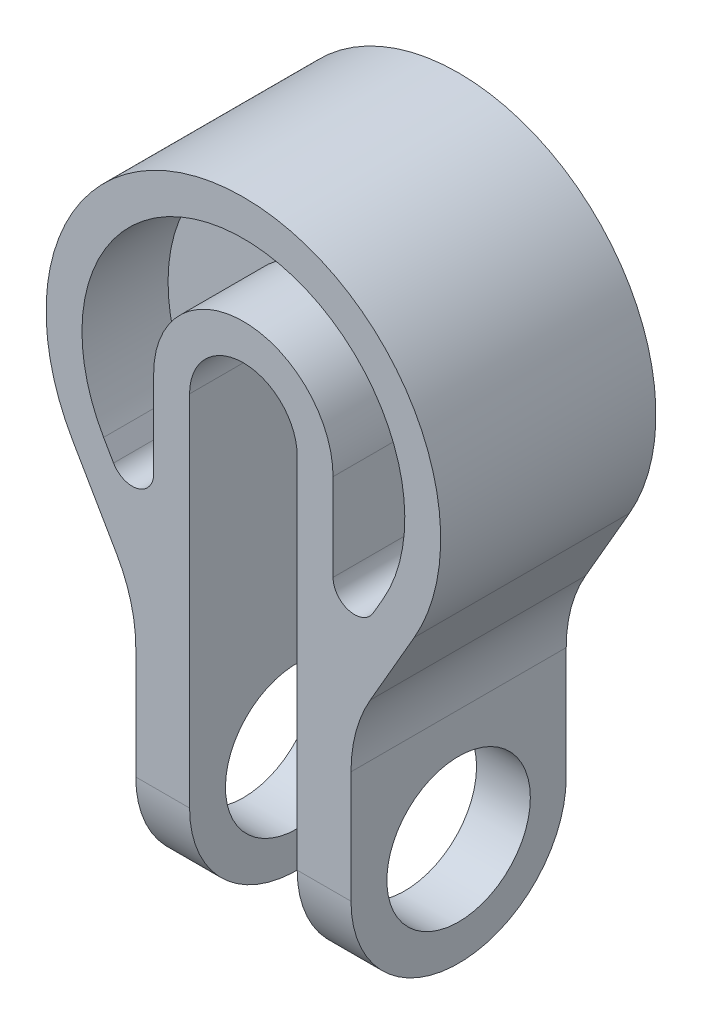
ISO-10303-21;
HEADER;
FILE_DESCRIPTION(('STEP AP214'),'2;1');
FILE_NAME('part.step','',(''),(''),'','','');
FILE_SCHEMA(('AUTOMOTIVE_DESIGN { 1 0 10303 214 1 1 1 1 }'));
ENDSEC;
DATA;
#1=APPLICATION_CONTEXT('core data for automotive mechanical design processes');
#2=APPLICATION_PROTOCOL_DEFINITION('international standard','automotive_design',2000,#1);
#3=PRODUCT_CONTEXT('',#1,'mechanical');
#4=PRODUCT('Part','Part','',(#3));
#5=PRODUCT_RELATED_PRODUCT_CATEGORY('part','',(#4));
#6=PRODUCT_DEFINITION_FORMATION('','',#4);
#7=PRODUCT_DEFINITION_CONTEXT('part definition',#1,'design');
#8=PRODUCT_DEFINITION('design','',#6,#7);
#9=PRODUCT_DEFINITION_SHAPE('','',#8);
#10=(LENGTH_UNIT() NAMED_UNIT(*) SI_UNIT(.MILLI.,.METRE.));
#11=(NAMED_UNIT(*) PLANE_ANGLE_UNIT() SI_UNIT($,.RADIAN.));
#12=(NAMED_UNIT(*) SI_UNIT($,.STERADIAN.) SOLID_ANGLE_UNIT());
#13=UNCERTAINTY_MEASURE_WITH_UNIT(LENGTH_MEASURE(1.E-05),#10,'distance_accuracy_value','');
#14=(GEOMETRIC_REPRESENTATION_CONTEXT(3) GLOBAL_UNCERTAINTY_ASSIGNED_CONTEXT((#13)) GLOBAL_UNIT_ASSIGNED_CONTEXT((#10,
#11,#12)) REPRESENTATION_CONTEXT('',''));
#15=CARTESIAN_POINT('',(0.,0.,0.));
#16=DIRECTION('',(0.,0.,1.));
#17=DIRECTION('',(1.,0.,0.));
#18=AXIS2_PLACEMENT_3D('',#15,#16,#17);
#19=CARTESIAN_POINT('',(0.,0.,-15.));
#20=DIRECTION('',(0.,0.,-1.));
#21=DIRECTION('',(1.,0.,0.));
#22=AXIS2_PLACEMENT_3D('',#19,#20,#21);
#23=PLANE('',#22);
#24=CARTESIAN_POINT('',(0.,0.,-15.));
#25=DIRECTION('',(0.,0.,1.));
#26=DIRECTION('',(1.,0.,0.));
#27=AXIS2_PLACEMENT_3D('',#24,#25,#26);
#28=CIRCLE('',#27,22.5);
#29=CARTESIAN_POINT('',(19.4855715851499,-11.2499999999999,-15.));
#30=VERTEX_POINT('',#29);
#31=CARTESIAN_POINT('',(-19.4855715851499,-11.2499999999999,-15.));
#32=VERTEX_POINT('',#31);
#33=EDGE_CURVE('E545',#30,#32,#28,.T.);
#34=ORIENTED_EDGE('',*,*,#33,.T.);
#35=DIRECTION('',(0.499999999999995,-0.866025403784441,0.));
#36=VECTOR('',#35,1.);
#37=CARTESIAN_POINT('',(-19.4855715851499,-11.2499999999999,-15.));
#38=LINE('',#37,#36);
#39=CARTESIAN_POINT('',(-18.0980762113533,-13.6532124826824,-15.));
#40=VERTEX_POINT('',#39);
#41=EDGE_CURVE('E538',#32,#40,#38,.T.);
#42=ORIENTED_EDGE('',*,*,#41,.T.);
#43=CARTESIAN_POINT('',(-15.5,-12.1532124826824,-15.));
#44=DIRECTION('',(0.,0.,1.));
#45=DIRECTION('',(-1.,0.,0.));
#46=AXIS2_PLACEMENT_3D('',#43,#44,#45);
#47=CIRCLE('',#46,3.);
#48=CARTESIAN_POINT('',(-12.5,-12.1532124826824,-15.));
#49=VERTEX_POINT('',#48);
#50=EDGE_CURVE('E534',#40,#49,#47,.T.);
#51=ORIENTED_EDGE('',*,*,#50,.T.);
#52=DIRECTION('',(0.,1.,0.));
#53=VECTOR('',#52,1.);
#54=CARTESIAN_POINT('',(-12.5,0.,-15.));
#55=LINE('',#54,#53);
#56=CARTESIAN_POINT('',(-12.5,0.,-15.));
#57=VERTEX_POINT('',#56);
#58=EDGE_CURVE('E529',#49,#57,#55,.T.);
#59=ORIENTED_EDGE('',*,*,#58,.T.);
#60=CARTESIAN_POINT('',(0.,0.,-15.));
#61=DIRECTION('',(0.,0.,-1.));
#62=DIRECTION('',(1.,0.,0.));
#63=AXIS2_PLACEMENT_3D('',#60,#61,#62);
#64=CIRCLE('',#63,12.5);
#65=CARTESIAN_POINT('',(12.5,0.,-15.));
#66=VERTEX_POINT('',#65);
#67=EDGE_CURVE('E528',#57,#66,#64,.T.);
#68=ORIENTED_EDGE('',*,*,#67,.T.);
#69=DIRECTION('',(0.,-1.,0.));
#70=VECTOR('',#69,1.);
#71=CARTESIAN_POINT('',(12.5,0.,-15.));
#72=LINE('',#71,#70);
#73=CARTESIAN_POINT('',(12.5,-12.1532124826824,-15.));
#74=VERTEX_POINT('',#73);
#75=EDGE_CURVE('E525',#66,#74,#72,.T.);
#76=ORIENTED_EDGE('',*,*,#75,.T.);
#77=CARTESIAN_POINT('',(15.5,-12.1532124826824,-15.));
#78=DIRECTION('',(0.,0.,1.));
#79=DIRECTION('',(1.,0.,0.));
#80=AXIS2_PLACEMENT_3D('',#77,#78,#79);
#81=CIRCLE('',#80,3.);
#82=CARTESIAN_POINT('',(18.0980762113533,-13.6532124826824,-15.));
#83=VERTEX_POINT('',#82);
#84=EDGE_CURVE('E519',#74,#83,#81,.T.);
#85=ORIENTED_EDGE('',*,*,#84,.T.);
#86=DIRECTION('',(0.499999999999994,0.866025403784442,0.));
#87=VECTOR('',#86,1.);
#88=CARTESIAN_POINT('',(19.4855715851499,-11.2499999999999,-15.));
#89=LINE('',#88,#87);
#90=EDGE_CURVE('E511',#83,#30,#89,.T.);
#91=ORIENTED_EDGE('',*,*,#90,.T.);
#92=EDGE_LOOP('',(#34,#42,#51,#59,#68,#76,#85,#91));
#93=FACE_BOUND('',#92,.T.);
#94=DIRECTION('',(0.,1.,0.));
#95=VECTOR('',#94,1.);
#96=CARTESIAN_POINT('',(-7.5,0.,-15.));
#97=LINE('',#96,#95);
#98=CARTESIAN_POINT('',(-7.49999999999999,-50.,-15.));
#99=VERTEX_POINT('',#98);
#100=CARTESIAN_POINT('',(-7.5,0.,-15.));
#101=VERTEX_POINT('',#100);
#102=EDGE_CURVE('E281',#99,#101,#97,.T.);
#103=ORIENTED_EDGE('',*,*,#102,.F.);
#104=DIRECTION('',(-1.,0.,0.));
#105=VECTOR('',#104,1.);
#106=CARTESIAN_POINT('',(27.501,-50.,-15.));
#107=LINE('',#106,#105);
#108=CARTESIAN_POINT('',(-15.,-50.,-15.));
#109=VERTEX_POINT('',#108);
#110=EDGE_CURVE('E287',#99,#109,#107,.T.);
#111=ORIENTED_EDGE('',*,*,#110,.T.);
#112=DIRECTION('',(0.,-1.,0.));
#113=VECTOR('',#112,1.);
#114=CARTESIAN_POINT('',(-15.,-42.2959682021173,-15.));
#115=LINE('',#114,#113);
#116=CARTESIAN_POINT('',(-15.,-34.3782217350893,-15.));
#117=VERTEX_POINT('',#116);
#118=EDGE_CURVE('E301',#117,#109,#115,.T.);
#119=ORIENTED_EDGE('',*,*,#118,.F.);
#120=CARTESIAN_POINT('',(-35.,-34.3782217350893,-15.));
#121=DIRECTION('',(0.,0.,-1.));
#122=DIRECTION('',(1.,0.,0.));
#123=AXIS2_PLACEMENT_3D('',#120,#121,#122);
#124=CIRCLE('',#123,20.);
#125=CARTESIAN_POINT('',(-17.6794919243112,-24.3782217350893,-15.));
#126=VERTEX_POINT('',#125);
#127=EDGE_CURVE('E310',#126,#117,#124,.T.);
#128=ORIENTED_EDGE('',*,*,#127,.F.);
#129=DIRECTION('',(0.500000000000001,-0.866025403784438,0.));
#130=VECTOR('',#129,1.);
#131=CARTESIAN_POINT('',(-23.8156986040721,-13.75,-15.));
#132=LINE('',#131,#130);
#133=CARTESIAN_POINT('',(-23.8156986040721,-13.75,-15.));
#134=VERTEX_POINT('',#133);
#135=EDGE_CURVE('E480',#134,#126,#132,.T.);
#136=ORIENTED_EDGE('',*,*,#135,.F.);
#137=CARTESIAN_POINT('',(0.,0.,-15.));
#138=DIRECTION('',(0.,0.,1.));
#139=DIRECTION('',(1.,0.,0.));
#140=AXIS2_PLACEMENT_3D('',#137,#138,#139);
#141=CIRCLE('',#140,27.5);
#142=CARTESIAN_POINT('',(23.8156986040721,-13.75,-15.));
#143=VERTEX_POINT('',#142);
#144=EDGE_CURVE('E483',#143,#134,#141,.T.);
#145=ORIENTED_EDGE('',*,*,#144,.F.);
#146=DIRECTION('',(0.5,0.866025403784439,0.));
#147=VECTOR('',#146,1.);
#148=CARTESIAN_POINT('',(23.8156986040721,-13.75,-15.));
#149=LINE('',#148,#147);
#150=CARTESIAN_POINT('',(17.6794919243112,-24.3782217350893,-15.));
#151=VERTEX_POINT('',#150);
#152=EDGE_CURVE('E323',#151,#143,#149,.T.);
#153=ORIENTED_EDGE('',*,*,#152,.F.);
#154=CARTESIAN_POINT('',(35.,-34.3782217350893,-15.));
#155=DIRECTION('',(0.,0.,-1.));
#156=DIRECTION('',(-1.,0.,0.));
#157=AXIS2_PLACEMENT_3D('',#154,#155,#156);
#158=CIRCLE('',#157,20.);
#159=CARTESIAN_POINT('',(15.,-34.3782217350893,-15.));
#160=VERTEX_POINT('',#159);
#161=EDGE_CURVE('E317',#160,#151,#158,.T.);
#162=ORIENTED_EDGE('',*,*,#161,.F.);
#163=DIRECTION('',(0.,1.,0.));
#164=VECTOR('',#163,1.);
#165=CARTESIAN_POINT('',(15.,-65.,-15.));
#166=LINE('',#165,#164);
#167=CARTESIAN_POINT('',(15.,-50.,-15.));
#168=VERTEX_POINT('',#167);
#169=EDGE_CURVE('E316',#168,#160,#166,.T.);
#170=ORIENTED_EDGE('',*,*,#169,.F.);
#171=DIRECTION('',(1.,0.,0.));
#172=VECTOR('',#171,1.);
#173=CARTESIAN_POINT('',(-27.501,-50.,-15.));
#174=LINE('',#173,#172);
#175=CARTESIAN_POINT('',(7.50000000000001,-50.,-15.));
#176=VERTEX_POINT('',#175);
#177=EDGE_CURVE('E578',#176,#168,#174,.T.);
#178=ORIENTED_EDGE('',*,*,#177,.F.);
#179=DIRECTION('',(0.,-1.,0.));
#180=VECTOR('',#179,1.);
#181=CARTESIAN_POINT('',(7.5,0.,-15.));
#182=LINE('',#181,#180);
#183=CARTESIAN_POINT('',(7.5,0.,-15.));
#184=VERTEX_POINT('',#183);
#185=EDGE_CURVE('E307',#184,#176,#182,.T.);
#186=ORIENTED_EDGE('',*,*,#185,.F.);
#187=CARTESIAN_POINT('',(0.,0.,-15.));
#188=DIRECTION('',(0.,0.,-1.));
#189=DIRECTION('',(1.,0.,0.));
#190=AXIS2_PLACEMENT_3D('',#187,#188,#189);
#191=CIRCLE('',#190,7.5);
#192=EDGE_CURVE('E303',#101,#184,#191,.T.);
#193=ORIENTED_EDGE('',*,*,#192,.F.);
#194=EDGE_LOOP('',(#103,#111,#119,#128,#136,#145,#153,#162,#170,#178,#186,#193));
#195=FACE_BOUND('',#194,.T.);
#196=ADVANCED_FACE('F91',(#93,#195),#23,.T.);
#197=CARTESIAN_POINT('',(0.,0.,15.));
#198=DIRECTION('',(0.,0.,1.));
#199=DIRECTION('',(1.,0.,0.));
#200=AXIS2_PLACEMENT_3D('',#197,#198,#199);
#201=PLANE('',#200);
#202=DIRECTION('',(-1.,0.,0.));
#203=VECTOR('',#202,1.);
#204=CARTESIAN_POINT('',(27.501,-50.,15.));
#205=LINE('',#204,#203);
#206=CARTESIAN_POINT('',(-7.49999999999999,-50.,15.));
#207=VERTEX_POINT('',#206);
#208=CARTESIAN_POINT('',(-15.,-50.,15.));
#209=VERTEX_POINT('',#208);
#210=EDGE_CURVE('E589',#207,#209,#205,.T.);
#211=ORIENTED_EDGE('',*,*,#210,.F.);
#212=DIRECTION('',(0.,1.,0.));
#213=VECTOR('',#212,1.);
#214=CARTESIAN_POINT('',(-7.5,0.,15.));
#215=LINE('',#214,#213);
#216=CARTESIAN_POINT('',(-7.5,0.,15.));
#217=VERTEX_POINT('',#216);
#218=EDGE_CURVE('E288',#207,#217,#215,.T.);
#219=ORIENTED_EDGE('',*,*,#218,.T.);
#220=CARTESIAN_POINT('',(0.,0.,15.));
#221=DIRECTION('',(0.,0.,-1.));
#222=DIRECTION('',(1.,0.,0.));
#223=AXIS2_PLACEMENT_3D('',#220,#221,#222);
#224=CIRCLE('',#223,7.5);
#225=CARTESIAN_POINT('',(7.5,0.,15.));
#226=VERTEX_POINT('',#225);
#227=EDGE_CURVE('E431',#217,#226,#224,.T.);
#228=ORIENTED_EDGE('',*,*,#227,.T.);
#229=DIRECTION('',(0.,-1.,0.));
#230=VECTOR('',#229,1.);
#231=CARTESIAN_POINT('',(7.5,0.,15.));
#232=LINE('',#231,#230);
#233=CARTESIAN_POINT('',(7.50000000000001,-50.,15.));
#234=VERTEX_POINT('',#233);
#235=EDGE_CURVE('E432',#226,#234,#232,.T.);
#236=ORIENTED_EDGE('',*,*,#235,.T.);
#237=DIRECTION('',(1.,0.,0.));
#238=VECTOR('',#237,1.);
#239=CARTESIAN_POINT('',(-27.501,-50.,15.));
#240=LINE('',#239,#238);
#241=CARTESIAN_POINT('',(15.,-50.,15.));
#242=VERTEX_POINT('',#241);
#243=EDGE_CURVE('E568',#234,#242,#240,.T.);
#244=ORIENTED_EDGE('',*,*,#243,.T.);
#245=DIRECTION('',(0.,1.,0.));
#246=VECTOR('',#245,1.);
#247=CARTESIAN_POINT('',(15.,-65.,15.));
#248=LINE('',#247,#246);
#249=CARTESIAN_POINT('',(15.,-34.3782217350893,15.));
#250=VERTEX_POINT('',#249);
#251=EDGE_CURVE('E437',#242,#250,#248,.T.);
#252=ORIENTED_EDGE('',*,*,#251,.T.);
#253=CARTESIAN_POINT('',(35.,-34.3782217350893,15.));
#254=DIRECTION('',(0.,0.,-1.));
#255=DIRECTION('',(-1.,0.,0.));
#256=AXIS2_PLACEMENT_3D('',#253,#254,#255);
#257=CIRCLE('',#256,20.);
#258=CARTESIAN_POINT('',(17.6794919243112,-24.3782217350893,15.));
#259=VERTEX_POINT('',#258);
#260=EDGE_CURVE('E442',#250,#259,#257,.T.);
#261=ORIENTED_EDGE('',*,*,#260,.T.);
#262=DIRECTION('',(0.5,0.866025403784439,0.));
#263=VECTOR('',#262,1.);
#264=CARTESIAN_POINT('',(23.8156986040721,-13.75,15.));
#265=LINE('',#264,#263);
#266=CARTESIAN_POINT('',(23.8156986040721,-13.75,15.));
#267=VERTEX_POINT('',#266);
#268=EDGE_CURVE('E441',#259,#267,#265,.T.);
#269=ORIENTED_EDGE('',*,*,#268,.T.);
#270=CARTESIAN_POINT('',(0.,0.,15.));
#271=DIRECTION('',(0.,0.,1.));
#272=DIRECTION('',(1.,0.,0.));
#273=AXIS2_PLACEMENT_3D('',#270,#271,#272);
#274=CIRCLE('',#273,27.5);
#275=CARTESIAN_POINT('',(-23.8156986040721,-13.75,15.));
#276=VERTEX_POINT('',#275);
#277=EDGE_CURVE('E391',#267,#276,#274,.T.);
#278=ORIENTED_EDGE('',*,*,#277,.T.);
#279=DIRECTION('',(0.500000000000001,-0.866025403784438,0.));
#280=VECTOR('',#279,1.);
#281=CARTESIAN_POINT('',(-23.8156986040721,-13.75,15.));
#282=LINE('',#281,#280);
#283=CARTESIAN_POINT('',(-17.6794919243112,-24.3782217350893,15.));
#284=VERTEX_POINT('',#283);
#285=EDGE_CURVE('E420',#276,#284,#282,.T.);
#286=ORIENTED_EDGE('',*,*,#285,.T.);
#287=CARTESIAN_POINT('',(-35.,-34.3782217350893,15.));
#288=DIRECTION('',(0.,0.,-1.));
#289=DIRECTION('',(1.,0.,0.));
#290=AXIS2_PLACEMENT_3D('',#287,#288,#289);
#291=CIRCLE('',#290,20.);
#292=CARTESIAN_POINT('',(-15.,-34.3782217350893,15.));
#293=VERTEX_POINT('',#292);
#294=EDGE_CURVE('E425',#284,#293,#291,.T.);
#295=ORIENTED_EDGE('',*,*,#294,.T.);
#296=DIRECTION('',(0.,-1.,0.));
#297=VECTOR('',#296,1.);
#298=CARTESIAN_POINT('',(-15.,-42.2959682021173,15.));
#299=LINE('',#298,#297);
#300=EDGE_CURVE('E422',#293,#209,#299,.T.);
#301=ORIENTED_EDGE('',*,*,#300,.T.);
#302=EDGE_LOOP('',(#211,#219,#228,#236,#244,#252,#261,#269,#278,#286,#295,#301));
#303=FACE_BOUND('',#302,.T.);
#304=CARTESIAN_POINT('',(0.,0.,15.));
#305=DIRECTION('',(0.,0.,1.));
#306=DIRECTION('',(1.,0.,0.));
#307=AXIS2_PLACEMENT_3D('',#304,#305,#306);
#308=CIRCLE('',#307,22.5);
#309=CARTESIAN_POINT('',(19.4855715851499,-11.2499999999999,15.));
#310=VERTEX_POINT('',#309);
#311=CARTESIAN_POINT('',(-19.4855715851499,-11.2499999999999,15.));
#312=VERTEX_POINT('',#311);
#313=EDGE_CURVE('E330',#310,#312,#308,.T.);
#314=ORIENTED_EDGE('',*,*,#313,.F.);
#315=DIRECTION('',(0.499999999999994,0.866025403784442,0.));
#316=VECTOR('',#315,1.);
#317=CARTESIAN_POINT('',(19.4855715851499,-11.2499999999999,15.));
#318=LINE('',#317,#316);
#319=CARTESIAN_POINT('',(18.0980762113533,-13.6532124826824,15.));
#320=VERTEX_POINT('',#319);
#321=EDGE_CURVE('E334',#320,#310,#318,.T.);
#322=ORIENTED_EDGE('',*,*,#321,.F.);
#323=CARTESIAN_POINT('',(15.5,-12.1532124826824,15.));
#324=DIRECTION('',(0.,0.,1.));
#325=DIRECTION('',(1.,0.,0.));
#326=AXIS2_PLACEMENT_3D('',#323,#324,#325);
#327=CIRCLE('',#326,3.);
#328=CARTESIAN_POINT('',(12.5,-12.1532124826824,15.));
#329=VERTEX_POINT('',#328);
#330=EDGE_CURVE('E383',#329,#320,#327,.T.);
#331=ORIENTED_EDGE('',*,*,#330,.F.);
#332=DIRECTION('',(0.,-1.,0.));
#333=VECTOR('',#332,1.);
#334=CARTESIAN_POINT('',(12.5,0.,15.));
#335=LINE('',#334,#333);
#336=CARTESIAN_POINT('',(12.5,0.,15.));
#337=VERTEX_POINT('',#336);
#338=EDGE_CURVE('E379',#337,#329,#335,.T.);
#339=ORIENTED_EDGE('',*,*,#338,.F.);
#340=CARTESIAN_POINT('',(0.,0.,15.));
#341=DIRECTION('',(0.,0.,-1.));
#342=DIRECTION('',(1.,0.,0.));
#343=AXIS2_PLACEMENT_3D('',#340,#341,#342);
#344=CIRCLE('',#343,12.5);
#345=CARTESIAN_POINT('',(-12.5,0.,15.));
#346=VERTEX_POINT('',#345);
#347=EDGE_CURVE('E376',#346,#337,#344,.T.);
#348=ORIENTED_EDGE('',*,*,#347,.F.);
#349=DIRECTION('',(0.,1.,0.));
#350=VECTOR('',#349,1.);
#351=CARTESIAN_POINT('',(-12.5,0.,15.));
#352=LINE('',#351,#350);
#353=CARTESIAN_POINT('',(-12.5,-12.1532124826824,15.));
#354=VERTEX_POINT('',#353);
#355=EDGE_CURVE('E375',#354,#346,#352,.T.);
#356=ORIENTED_EDGE('',*,*,#355,.F.);
#357=CARTESIAN_POINT('',(-15.5,-12.1532124826824,15.));
#358=DIRECTION('',(0.,0.,1.));
#359=DIRECTION('',(-1.,0.,0.));
#360=AXIS2_PLACEMENT_3D('',#357,#358,#359);
#361=CIRCLE('',#360,3.);
#362=CARTESIAN_POINT('',(-18.0980762113533,-13.6532124826824,15.));
#363=VERTEX_POINT('',#362);
#364=EDGE_CURVE('E366',#363,#354,#361,.T.);
#365=ORIENTED_EDGE('',*,*,#364,.F.);
#366=DIRECTION('',(0.499999999999995,-0.866025403784441,0.));
#367=VECTOR('',#366,1.);
#368=CARTESIAN_POINT('',(-19.4855715851499,-11.2499999999999,15.));
#369=LINE('',#368,#367);
#370=EDGE_CURVE('E365',#312,#363,#369,.T.);
#371=ORIENTED_EDGE('',*,*,#370,.F.);
#372=EDGE_LOOP('',(#314,#322,#331,#339,#348,#356,#365,#371));
#373=FACE_BOUND('',#372,.T.);
#374=ADVANCED_FACE('F621',(#303,#373),#201,.T.);
#375=CARTESIAN_POINT('',(0.,0.,15.));
#376=DIRECTION('',(0.,0.,-1.));
#377=DIRECTION('',(-1.,0.,0.));
#378=AXIS2_PLACEMENT_3D('',#375,#376,#377);
#379=CYLINDRICAL_SURFACE('',#378,27.5);
#380=DIRECTION('',(0.,0.,-1.));
#381=VECTOR('',#380,1.);
#382=CARTESIAN_POINT('',(23.8156986040721,-13.75,15.));
#383=LINE('',#382,#381);
#384=EDGE_CURVE('E450',#267,#143,#383,.T.);
#385=ORIENTED_EDGE('',*,*,#384,.T.);
#386=ORIENTED_EDGE('',*,*,#144,.T.);
#387=DIRECTION('',(0.,0.,-1.));
#388=VECTOR('',#387,1.);
#389=CARTESIAN_POINT('',(-23.8156986040721,-13.75,15.));
#390=LINE('',#389,#388);
#391=EDGE_CURVE('E12',#276,#134,#390,.T.);
#392=ORIENTED_EDGE('',*,*,#391,.F.);
#393=ORIENTED_EDGE('',*,*,#277,.F.);
#394=EDGE_LOOP('',(#385,#386,#392,#393));
#395=FACE_BOUND('',#394,.T.);
#396=ADVANCED_FACE('F92',(#395),#379,.T.);
#397=CARTESIAN_POINT('',(-23.8156986040721,-13.75,15.));
#398=DIRECTION('',(0.866025403784438,0.500000000000001,0.));
#399=DIRECTION('',(-0.500000000000001,0.866025403784438,0.));
#400=AXIS2_PLACEMENT_3D('',#397,#398,#399);
#401=PLANE('',#400);
#402=ORIENTED_EDGE('',*,*,#391,.T.);
#403=ORIENTED_EDGE('',*,*,#135,.T.);
#404=DIRECTION('',(0.,0.,-1.));
#405=VECTOR('',#404,1.);
#406=CARTESIAN_POINT('',(-17.6794919243112,-24.3782217350893,15.));
#407=LINE('',#406,#405);
#408=EDGE_CURVE('E105',#284,#126,#407,.T.);
#409=ORIENTED_EDGE('',*,*,#408,.F.);
#410=ORIENTED_EDGE('',*,*,#285,.F.);
#411=EDGE_LOOP('',(#402,#403,#409,#410));
#412=FACE_BOUND('',#411,.T.);
#413=ADVANCED_FACE('F477',(#412),#401,.F.);
#414=CARTESIAN_POINT('',(-35.,-34.3782217350893,15.));
#415=DIRECTION('',(0.,0.,-1.));
#416=DIRECTION('',(-1.,0.,0.));
#417=AXIS2_PLACEMENT_3D('',#414,#415,#416);
#418=CYLINDRICAL_SURFACE('',#417,20.);
#419=ORIENTED_EDGE('',*,*,#408,.T.);
#420=ORIENTED_EDGE('',*,*,#127,.T.);
#421=DIRECTION('',(0.,0.,-1.));
#422=VECTOR('',#421,1.);
#423=CARTESIAN_POINT('',(-15.,-34.3782217350893,15.));
#424=LINE('',#423,#422);
#425=EDGE_CURVE('E464',#293,#117,#424,.T.);
#426=ORIENTED_EDGE('',*,*,#425,.F.);
#427=ORIENTED_EDGE('',*,*,#294,.F.);
#428=EDGE_LOOP('',(#419,#420,#426,#427));
#429=FACE_BOUND('',#428,.T.);
#430=ADVANCED_FACE('F473',(#429),#418,.F.);
#431=CARTESIAN_POINT('',(-15.,-65.,15.));
#432=DIRECTION('',(1.,0.,0.));
#433=DIRECTION('',(0.,0.,-1.));
#434=AXIS2_PLACEMENT_3D('',#431,#432,#433);
#435=PLANE('',#434);
#436=ORIENTED_EDGE('',*,*,#118,.T.);
#437=CARTESIAN_POINT('',(-15.,-50.,0.));
#438=DIRECTION('',(1.,0.,0.));
#439=DIRECTION('',(0.,0.,-1.));
#440=AXIS2_PLACEMENT_3D('',#437,#438,#439);
#441=CIRCLE('',#440,15.);
#442=EDGE_CURVE('E108',#209,#109,#441,.T.);
#443=ORIENTED_EDGE('',*,*,#442,.F.);
#444=ORIENTED_EDGE('',*,*,#300,.F.);
#445=ORIENTED_EDGE('',*,*,#425,.T.);
#446=EDGE_LOOP('',(#436,#443,#444,#445));
#447=FACE_BOUND('',#446,.T.);
#448=CARTESIAN_POINT('',(-15.,-50.,0.));
#449=DIRECTION('',(1.,0.,0.));
#450=DIRECTION('',(0.,0.,-1.));
#451=AXIS2_PLACEMENT_3D('',#448,#449,#450);
#452=CIRCLE('',#451,10.);
#453=CARTESIAN_POINT('',(-15.,-50.,-10.));
#454=VERTEX_POINT('',#453);
#455=EDGE_CURVE('E297',#454,#454,#452,.T.);
#456=ORIENTED_EDGE('',*,*,#455,.T.);
#457=EDGE_LOOP('',(#456));
#458=FACE_BOUND('',#457,.T.);
#459=ADVANCED_FACE('F605',(#447,#458),#435,.F.);
#460=CARTESIAN_POINT('',(-7.5,0.,15.));
#461=DIRECTION('',(-1.,0.,0.));
#462=DIRECTION('',(0.,-1.,0.));
#463=AXIS2_PLACEMENT_3D('',#460,#461,#462);
#464=PLANE('',#463);
#465=CARTESIAN_POINT('',(-7.49999999999999,-50.,0.));
#466=DIRECTION('',(-1.,0.,0.));
#467=DIRECTION('',(0.,-1.,0.));
#468=AXIS2_PLACEMENT_3D('',#465,#466,#467);
#469=CIRCLE('',#468,15.);
#470=EDGE_CURVE('E276',#99,#207,#469,.T.);
#471=ORIENTED_EDGE('',*,*,#470,.F.);
#472=ORIENTED_EDGE('',*,*,#102,.T.);
#473=DIRECTION('',(0.,0.,-1.));
#474=VECTOR('',#473,1.);
#475=CARTESIAN_POINT('',(-7.5,0.,15.));
#476=LINE('',#475,#474);
#477=EDGE_CURVE('E458',#217,#101,#476,.T.);
#478=ORIENTED_EDGE('',*,*,#477,.F.);
#479=ORIENTED_EDGE('',*,*,#218,.F.);
#480=EDGE_LOOP('',(#471,#472,#478,#479));
#481=FACE_BOUND('',#480,.T.);
#482=CARTESIAN_POINT('',(-7.49999999999999,-50.,0.));
#483=DIRECTION('',(-1.,0.,0.));
#484=DIRECTION('',(0.,-1.,0.));
#485=AXIS2_PLACEMENT_3D('',#482,#483,#484);
#486=CIRCLE('',#485,10.);
#487=CARTESIAN_POINT('',(-7.49999999999999,-60.,0.));
#488=VERTEX_POINT('',#487);
#489=EDGE_CURVE('E592',#488,#488,#486,.T.);
#490=ORIENTED_EDGE('',*,*,#489,.T.);
#491=EDGE_LOOP('',(#490));
#492=FACE_BOUND('',#491,.T.);
#493=ADVANCED_FACE('F278',(#481,#492),#464,.F.);
#494=CARTESIAN_POINT('',(0.,0.,15.));
#495=DIRECTION('',(0.,0.,-1.));
#496=DIRECTION('',(-1.,0.,0.));
#497=AXIS2_PLACEMENT_3D('',#494,#495,#496);
#498=CYLINDRICAL_SURFACE('',#497,7.5);
#499=ORIENTED_EDGE('',*,*,#477,.T.);
#500=ORIENTED_EDGE('',*,*,#192,.T.);
#501=DIRECTION('',(0.,0.,-1.));
#502=VECTOR('',#501,1.);
#503=CARTESIAN_POINT('',(7.5,0.,15.));
#504=LINE('',#503,#502);
#505=EDGE_CURVE('E460',#226,#184,#504,.T.);
#506=ORIENTED_EDGE('',*,*,#505,.F.);
#507=ORIENTED_EDGE('',*,*,#227,.F.);
#508=EDGE_LOOP('',(#499,#500,#506,#507));
#509=FACE_BOUND('',#508,.T.);
#510=ADVANCED_FACE('F608',(#509),#498,.F.);
#511=CARTESIAN_POINT('',(7.5,0.,15.));
#512=DIRECTION('',(1.,0.,0.));
#513=DIRECTION('',(0.,1.,0.));
#514=AXIS2_PLACEMENT_3D('',#511,#512,#513);
#515=PLANE('',#514);
#516=CARTESIAN_POINT('',(7.50000000000001,-50.,0.));
#517=DIRECTION('',(1.,0.,0.));
#518=DIRECTION('',(0.,1.,0.));
#519=AXIS2_PLACEMENT_3D('',#516,#517,#518);
#520=CIRCLE('',#519,10.);
#521=CARTESIAN_POINT('',(7.50000000000001,-40.,0.));
#522=VERTEX_POINT('',#521);
#523=EDGE_CURVE('E584',#522,#522,#520,.F.);
#524=ORIENTED_EDGE('',*,*,#523,.F.);
#525=EDGE_LOOP('',(#524));
#526=FACE_BOUND('',#525,.T.);
#527=ORIENTED_EDGE('',*,*,#185,.T.);
#528=CARTESIAN_POINT('',(7.50000000000001,-50.,0.));
#529=DIRECTION('',(1.,0.,0.));
#530=DIRECTION('',(0.,1.,0.));
#531=AXIS2_PLACEMENT_3D('',#528,#529,#530);
#532=CIRCLE('',#531,15.);
#533=EDGE_CURVE('E120',#176,#234,#532,.F.);
#534=ORIENTED_EDGE('',*,*,#533,.T.);
#535=ORIENTED_EDGE('',*,*,#235,.F.);
#536=ORIENTED_EDGE('',*,*,#505,.T.);
#537=EDGE_LOOP('',(#527,#534,#535,#536));
#538=FACE_BOUND('',#537,.T.);
#539=ADVANCED_FACE('F620',(#526,#538),#515,.F.);
#540=CARTESIAN_POINT('',(15.,-65.,15.));
#541=DIRECTION('',(-1.,0.,0.));
#542=DIRECTION('',(0.,0.,1.));
#543=AXIS2_PLACEMENT_3D('',#540,#541,#542);
#544=PLANE('',#543);
#545=CARTESIAN_POINT('',(15.,-50.,0.));
#546=DIRECTION('',(1.,0.,0.));
#547=DIRECTION('',(0.,0.,-1.));
#548=AXIS2_PLACEMENT_3D('',#545,#546,#547);
#549=CIRCLE('',#548,10.);
#550=CARTESIAN_POINT('',(15.,-50.,-10.));
#551=VERTEX_POINT('',#550);
#552=EDGE_CURVE('E583',#551,#551,#549,.T.);
#553=ORIENTED_EDGE('',*,*,#552,.F.);
#554=EDGE_LOOP('',(#553));
#555=FACE_BOUND('',#554,.T.);
#556=CARTESIAN_POINT('',(15.,-50.,0.));
#557=DIRECTION('',(1.,0.,0.));
#558=DIRECTION('',(0.,0.,-1.));
#559=AXIS2_PLACEMENT_3D('',#556,#557,#558);
#560=CIRCLE('',#559,15.);
#561=EDGE_CURVE('E546',#242,#168,#560,.T.);
#562=ORIENTED_EDGE('',*,*,#561,.T.);
#563=ORIENTED_EDGE('',*,*,#169,.T.);
#564=DIRECTION('',(0.,0.,-1.));
#565=VECTOR('',#564,1.);
#566=CARTESIAN_POINT('',(15.,-34.3782217350893,15.));
#567=LINE('',#566,#565);
#568=EDGE_CURVE('E451',#250,#160,#567,.T.);
#569=ORIENTED_EDGE('',*,*,#568,.F.);
#570=ORIENTED_EDGE('',*,*,#251,.F.);
#571=EDGE_LOOP('',(#562,#563,#569,#570));
#572=FACE_BOUND('',#571,.T.);
#573=ADVANCED_FACE('F679',(#555,#572),#544,.F.);
#574=CARTESIAN_POINT('',(35.,-34.3782217350893,15.));
#575=DIRECTION('',(0.,0.,-1.));
#576=DIRECTION('',(-1.,0.,0.));
#577=AXIS2_PLACEMENT_3D('',#574,#575,#576);
#578=CYLINDRICAL_SURFACE('',#577,20.);
#579=ORIENTED_EDGE('',*,*,#568,.T.);
#580=ORIENTED_EDGE('',*,*,#161,.T.);
#581=DIRECTION('',(0.,0.,-1.));
#582=VECTOR('',#581,1.);
#583=CARTESIAN_POINT('',(17.6794919243112,-24.3782217350893,15.));
#584=LINE('',#583,#582);
#585=EDGE_CURVE('E448',#259,#151,#584,.T.);
#586=ORIENTED_EDGE('',*,*,#585,.F.);
#587=ORIENTED_EDGE('',*,*,#260,.F.);
#588=EDGE_LOOP('',(#579,#580,#586,#587));
#589=FACE_BOUND('',#588,.T.);
#590=ADVANCED_FACE('F674',(#589),#578,.F.);
#591=CARTESIAN_POINT('',(23.8156986040721,-13.75,15.));
#592=DIRECTION('',(-0.866025403784438,0.5,0.));
#593=DIRECTION('',(-0.5,-0.866025403784439,0.));
#594=AXIS2_PLACEMENT_3D('',#591,#592,#593);
#595=PLANE('',#594);
#596=ORIENTED_EDGE('',*,*,#585,.T.);
#597=ORIENTED_EDGE('',*,*,#152,.T.);
#598=ORIENTED_EDGE('',*,*,#384,.F.);
#599=ORIENTED_EDGE('',*,*,#268,.F.);
#600=EDGE_LOOP('',(#596,#597,#598,#599));
#601=FACE_BOUND('',#600,.T.);
#602=ADVANCED_FACE('F668',(#601),#595,.F.);
#603=CARTESIAN_POINT('',(0.,0.,3.));
#604=DIRECTION('',(0.,0.,1.));
#605=DIRECTION('',(1.,0.,0.));
#606=AXIS2_PLACEMENT_3D('',#603,#604,#605);
#607=CYLINDRICAL_SURFACE('',#606,22.5);
#608=ORIENTED_EDGE('',*,*,#313,.T.);
#609=DIRECTION('',(0.,0.,1.));
#610=VECTOR('',#609,1.);
#611=CARTESIAN_POINT('',(-19.4855715851499,-11.2499999999999,3.));
#612=LINE('',#611,#610);
#613=CARTESIAN_POINT('',(-19.4855715851499,-11.2499999999999,3.));
#614=VERTEX_POINT('',#613);
#615=EDGE_CURVE('E363',#614,#312,#612,.T.);
#616=ORIENTED_EDGE('',*,*,#615,.F.);
#617=CARTESIAN_POINT('',(0.,0.,3.));
#618=DIRECTION('',(0.,0.,1.));
#619=DIRECTION('',(1.,0.,0.));
#620=AXIS2_PLACEMENT_3D('',#617,#618,#619);
#621=CIRCLE('',#620,22.5);
#622=CARTESIAN_POINT('',(19.4855715851499,-11.2499999999999,3.));
#623=VERTEX_POINT('',#622);
#624=EDGE_CURVE('E327',#623,#614,#621,.T.);
#625=ORIENTED_EDGE('',*,*,#624,.F.);
#626=DIRECTION('',(0.,0.,1.));
#627=VECTOR('',#626,1.);
#628=CARTESIAN_POINT('',(19.4855715851499,-11.2499999999999,3.));
#629=LINE('',#628,#627);
#630=EDGE_CURVE('E392',#623,#310,#629,.T.);
#631=ORIENTED_EDGE('',*,*,#630,.T.);
#632=EDGE_LOOP('',(#608,#616,#625,#631));
#633=FACE_BOUND('',#632,.T.);
#634=ADVANCED_FACE('F642',(#633),#607,.F.);
#635=CARTESIAN_POINT('',(19.4855715851499,-11.2499999999999,3.));
#636=DIRECTION('',(0.866025403784442,-0.499999999999995,0.));
#637=DIRECTION('',(0.499999999999995,0.866025403784442,0.));
#638=AXIS2_PLACEMENT_3D('',#635,#636,#637);
#639=PLANE('',#638);
#640=ORIENTED_EDGE('',*,*,#321,.T.);
#641=ORIENTED_EDGE('',*,*,#630,.F.);
#642=DIRECTION('',(0.499999999999994,0.866025403784442,0.));
#643=VECTOR('',#642,1.);
#644=CARTESIAN_POINT('',(19.4855715851499,-11.2499999999999,3.));
#645=LINE('',#644,#643);
#646=CARTESIAN_POINT('',(18.0980762113533,-13.6532124826824,3.));
#647=VERTEX_POINT('',#646);
#648=EDGE_CURVE('E360',#647,#623,#645,.T.);
#649=ORIENTED_EDGE('',*,*,#648,.F.);
#650=DIRECTION('',(0.,0.,1.));
#651=VECTOR('',#650,1.);
#652=CARTESIAN_POINT('',(18.0980762113533,-13.6532124826824,3.));
#653=LINE('',#652,#651);
#654=EDGE_CURVE('E393',#647,#320,#653,.T.);
#655=ORIENTED_EDGE('',*,*,#654,.T.);
#656=EDGE_LOOP('',(#640,#641,#649,#655));
#657=FACE_BOUND('',#656,.T.);
#658=ADVANCED_FACE('F643',(#657),#639,.F.);
#659=CARTESIAN_POINT('',(15.5,-12.1532124826824,3.));
#660=DIRECTION('',(0.,0.,1.));
#661=DIRECTION('',(1.,0.,0.));
#662=AXIS2_PLACEMENT_3D('',#659,#660,#661);
#663=CYLINDRICAL_SURFACE('',#662,3.);
#664=ORIENTED_EDGE('',*,*,#330,.T.);
#665=ORIENTED_EDGE('',*,*,#654,.F.);
#666=CARTESIAN_POINT('',(15.5,-12.1532124826824,3.));
#667=DIRECTION('',(0.,0.,1.));
#668=DIRECTION('',(1.,0.,0.));
#669=AXIS2_PLACEMENT_3D('',#666,#667,#668);
#670=CIRCLE('',#669,3.);
#671=CARTESIAN_POINT('',(12.5,-12.1532124826824,3.));
#672=VERTEX_POINT('',#671);
#673=EDGE_CURVE('E354',#672,#647,#670,.T.);
#674=ORIENTED_EDGE('',*,*,#673,.F.);
#675=DIRECTION('',(0.,0.,1.));
#676=VECTOR('',#675,1.);
#677=CARTESIAN_POINT('',(12.5,-12.1532124826824,3.));
#678=LINE('',#677,#676);
#679=EDGE_CURVE('E396',#672,#329,#678,.T.);
#680=ORIENTED_EDGE('',*,*,#679,.T.);
#681=EDGE_LOOP('',(#664,#665,#674,#680));
#682=FACE_BOUND('',#681,.T.);
#683=ADVANCED_FACE('F644',(#682),#663,.F.);
#684=CARTESIAN_POINT('',(12.5,0.,3.));
#685=DIRECTION('',(-1.,0.,0.));
#686=DIRECTION('',(0.,-1.,0.));
#687=AXIS2_PLACEMENT_3D('',#684,#685,#686);
#688=PLANE('',#687);
#689=ORIENTED_EDGE('',*,*,#338,.T.);
#690=ORIENTED_EDGE('',*,*,#679,.F.);
#691=DIRECTION('',(0.,-1.,0.));
#692=VECTOR('',#691,1.);
#693=CARTESIAN_POINT('',(12.5,0.,3.));
#694=LINE('',#693,#692);
#695=CARTESIAN_POINT('',(12.5,0.,3.));
#696=VERTEX_POINT('',#695);
#697=EDGE_CURVE('E349',#696,#672,#694,.T.);
#698=ORIENTED_EDGE('',*,*,#697,.F.);
#699=DIRECTION('',(0.,0.,1.));
#700=VECTOR('',#699,1.);
#701=CARTESIAN_POINT('',(12.5,0.,3.));
#702=LINE('',#701,#700);
#703=EDGE_CURVE('E402',#696,#337,#702,.T.);
#704=ORIENTED_EDGE('',*,*,#703,.T.);
#705=EDGE_LOOP('',(#689,#690,#698,#704));
#706=FACE_BOUND('',#705,.T.);
#707=ADVANCED_FACE('F647',(#706),#688,.F.);
#708=CARTESIAN_POINT('',(0.,0.,3.));
#709=DIRECTION('',(0.,0.,1.));
#710=DIRECTION('',(1.,0.,0.));
#711=AXIS2_PLACEMENT_3D('',#708,#709,#710);
#712=CYLINDRICAL_SURFACE('',#711,12.5);
#713=ORIENTED_EDGE('',*,*,#347,.T.);
#714=ORIENTED_EDGE('',*,*,#703,.F.);
#715=CARTESIAN_POINT('',(0.,0.,3.));
#716=DIRECTION('',(0.,0.,-1.));
#717=DIRECTION('',(1.,0.,0.));
#718=AXIS2_PLACEMENT_3D('',#715,#716,#717);
#719=CIRCLE('',#718,12.5);
#720=CARTESIAN_POINT('',(-12.5,0.,3.));
#721=VERTEX_POINT('',#720);
#722=EDGE_CURVE('E344',#721,#696,#719,.T.);
#723=ORIENTED_EDGE('',*,*,#722,.F.);
#724=DIRECTION('',(0.,0.,1.));
#725=VECTOR('',#724,1.);
#726=CARTESIAN_POINT('',(-12.5,0.,3.));
#727=LINE('',#726,#725);
#728=EDGE_CURVE('E404',#721,#346,#727,.T.);
#729=ORIENTED_EDGE('',*,*,#728,.T.);
#730=EDGE_LOOP('',(#713,#714,#723,#729));
#731=FACE_BOUND('',#730,.T.);
#732=ADVANCED_FACE('F653',(#731),#712,.T.);
#733=CARTESIAN_POINT('',(-12.5,0.,3.));
#734=DIRECTION('',(1.,0.,0.));
#735=DIRECTION('',(0.,0.,-1.));
#736=AXIS2_PLACEMENT_3D('',#733,#734,#735);
#737=PLANE('',#736);
#738=ORIENTED_EDGE('',*,*,#355,.T.);
#739=ORIENTED_EDGE('',*,*,#728,.F.);
#740=DIRECTION('',(0.,1.,0.));
#741=VECTOR('',#740,1.);
#742=CARTESIAN_POINT('',(-12.5,0.,3.));
#743=LINE('',#742,#741);
#744=CARTESIAN_POINT('',(-12.5,-12.1532124826824,3.));
#745=VERTEX_POINT('',#744);
#746=EDGE_CURVE('E343',#745,#721,#743,.T.);
#747=ORIENTED_EDGE('',*,*,#746,.F.);
#748=DIRECTION('',(0.,0.,1.));
#749=VECTOR('',#748,1.);
#750=CARTESIAN_POINT('',(-12.5,-12.1532124826824,3.));
#751=LINE('',#750,#749);
#752=EDGE_CURVE('E410',#745,#354,#751,.T.);
#753=ORIENTED_EDGE('',*,*,#752,.T.);
#754=EDGE_LOOP('',(#738,#739,#747,#753));
#755=FACE_BOUND('',#754,.T.);
#756=ADVANCED_FACE('F660',(#755),#737,.F.);
#757=CARTESIAN_POINT('',(-15.5,-12.1532124826824,3.));
#758=DIRECTION('',(0.,0.,1.));
#759=DIRECTION('',(1.,0.,0.));
#760=AXIS2_PLACEMENT_3D('',#757,#758,#759);
#761=CYLINDRICAL_SURFACE('',#760,3.);
#762=ORIENTED_EDGE('',*,*,#364,.T.);
#763=ORIENTED_EDGE('',*,*,#752,.F.);
#764=CARTESIAN_POINT('',(-15.5,-12.1532124826824,3.));
#765=DIRECTION('',(0.,0.,1.));
#766=DIRECTION('',(-1.,0.,0.));
#767=AXIS2_PLACEMENT_3D('',#764,#765,#766);
#768=CIRCLE('',#767,3.);
#769=CARTESIAN_POINT('',(-18.0980762113533,-13.6532124826824,3.));
#770=VERTEX_POINT('',#769);
#771=EDGE_CURVE('E340',#770,#745,#768,.T.);
#772=ORIENTED_EDGE('',*,*,#771,.F.);
#773=DIRECTION('',(0.,0.,1.));
#774=VECTOR('',#773,1.);
#775=CARTESIAN_POINT('',(-18.0980762113533,-13.6532124826824,3.));
#776=LINE('',#775,#774);
#777=EDGE_CURVE('E408',#770,#363,#776,.T.);
#778=ORIENTED_EDGE('',*,*,#777,.T.);
#779=EDGE_LOOP('',(#762,#763,#772,#778));
#780=FACE_BOUND('',#779,.T.);
#781=ADVANCED_FACE('F662',(#780),#761,.F.);
#782=CARTESIAN_POINT('',(-19.4855715851499,-11.2499999999999,3.));
#783=DIRECTION('',(-0.866025403784441,-0.499999999999995,0.));
#784=DIRECTION('',(0.499999999999995,-0.866025403784441,0.));
#785=AXIS2_PLACEMENT_3D('',#782,#783,#784);
#786=PLANE('',#785);
#787=ORIENTED_EDGE('',*,*,#370,.T.);
#788=ORIENTED_EDGE('',*,*,#777,.F.);
#789=DIRECTION('',(0.499999999999995,-0.866025403784441,0.));
#790=VECTOR('',#789,1.);
#791=CARTESIAN_POINT('',(-19.4855715851499,-11.2499999999999,3.));
#792=LINE('',#791,#790);
#793=EDGE_CURVE('E335',#614,#770,#792,.T.);
#794=ORIENTED_EDGE('',*,*,#793,.F.);
#795=ORIENTED_EDGE('',*,*,#615,.T.);
#796=EDGE_LOOP('',(#787,#788,#794,#795));
#797=FACE_BOUND('',#796,.T.);
#798=ADVANCED_FACE('F640',(#797),#786,.F.);
#799=CARTESIAN_POINT('',(0.,0.,3.));
#800=DIRECTION('',(0.,0.,1.));
#801=DIRECTION('',(1.,0.,0.));
#802=AXIS2_PLACEMENT_3D('',#799,#800,#801);
#803=PLANE('',#802);
#804=ORIENTED_EDGE('',*,*,#624,.T.);
#805=ORIENTED_EDGE('',*,*,#793,.T.);
#806=ORIENTED_EDGE('',*,*,#771,.T.);
#807=ORIENTED_EDGE('',*,*,#746,.T.);
#808=ORIENTED_EDGE('',*,*,#722,.T.);
#809=ORIENTED_EDGE('',*,*,#697,.T.);
#810=ORIENTED_EDGE('',*,*,#673,.T.);
#811=ORIENTED_EDGE('',*,*,#648,.T.);
#812=EDGE_LOOP('',(#804,#805,#806,#807,#808,#809,#810,#811));
#813=FACE_BOUND('',#812,.T.);
#814=ADVANCED_FACE('F638',(#813),#803,.T.);
#815=CARTESIAN_POINT('',(0.,0.,-3.));
#816=DIRECTION('',(0.,0.,-1.));
#817=DIRECTION('',(1.,0.,0.));
#818=AXIS2_PLACEMENT_3D('',#815,#816,#817);
#819=CYLINDRICAL_SURFACE('',#818,22.5);
#820=ORIENTED_EDGE('',*,*,#33,.F.);
#821=DIRECTION('',(0.,0.,-1.));
#822=VECTOR('',#821,1.);
#823=CARTESIAN_POINT('',(19.4855715851499,-11.2499999999999,-3.));
#824=LINE('',#823,#822);
#825=CARTESIAN_POINT('',(19.4855715851499,-11.2499999999999,-3.));
#826=VERTEX_POINT('',#825);
#827=EDGE_CURVE('E486',#826,#30,#824,.T.);
#828=ORIENTED_EDGE('',*,*,#827,.F.);
#829=CARTESIAN_POINT('',(0.,0.,-3.));
#830=DIRECTION('',(0.,0.,1.));
#831=DIRECTION('',(1.,0.,0.));
#832=AXIS2_PLACEMENT_3D('',#829,#830,#831);
#833=CIRCLE('',#832,22.5);
#834=CARTESIAN_POINT('',(-19.4855715851499,-11.2499999999999,-3.));
#835=VERTEX_POINT('',#834);
#836=EDGE_CURVE('E520',#826,#835,#833,.T.);
#837=ORIENTED_EDGE('',*,*,#836,.T.);
#838=DIRECTION('',(0.,0.,-1.));
#839=VECTOR('',#838,1.);
#840=CARTESIAN_POINT('',(-19.4855715851499,-11.2499999999999,-3.));
#841=LINE('',#840,#839);
#842=EDGE_CURVE('E487',#835,#32,#841,.T.);
#843=ORIENTED_EDGE('',*,*,#842,.T.);
#844=EDGE_LOOP('',(#820,#828,#837,#843));
#845=FACE_BOUND('',#844,.T.);
#846=ADVANCED_FACE('F632',(#845),#819,.F.);
#847=CARTESIAN_POINT('',(19.4855715851499,-11.2499999999999,-3.));
#848=DIRECTION('',(0.866025403784442,-0.499999999999995,0.));
#849=DIRECTION('',(0.499999999999995,0.866025403784442,0.));
#850=AXIS2_PLACEMENT_3D('',#847,#848,#849);
#851=PLANE('',#850);
#852=ORIENTED_EDGE('',*,*,#90,.F.);
#853=DIRECTION('',(0.,0.,-1.));
#854=VECTOR('',#853,1.);
#855=CARTESIAN_POINT('',(18.0980762113533,-13.6532124826824,-3.));
#856=LINE('',#855,#854);
#857=CARTESIAN_POINT('',(18.0980762113533,-13.6532124826824,-3.));
#858=VERTEX_POINT('',#857);
#859=EDGE_CURVE('E506',#858,#83,#856,.T.);
#860=ORIENTED_EDGE('',*,*,#859,.F.);
#861=DIRECTION('',(0.499999999999994,0.866025403784442,0.));
#862=VECTOR('',#861,1.);
#863=CARTESIAN_POINT('',(19.4855715851499,-11.2499999999999,-3.));
#864=LINE('',#863,#862);
#865=EDGE_CURVE('E492',#858,#826,#864,.T.);
#866=ORIENTED_EDGE('',*,*,#865,.T.);
#867=ORIENTED_EDGE('',*,*,#827,.T.);
#868=EDGE_LOOP('',(#852,#860,#866,#867));
#869=FACE_BOUND('',#868,.T.);
#870=ADVANCED_FACE('F725',(#869),#851,.F.);
#871=CARTESIAN_POINT('',(15.5,-12.1532124826824,-3.));
#872=DIRECTION('',(0.,0.,-1.));
#873=DIRECTION('',(1.,0.,0.));
#874=AXIS2_PLACEMENT_3D('',#871,#872,#873);
#875=CYLINDRICAL_SURFACE('',#874,3.);
#876=ORIENTED_EDGE('',*,*,#84,.F.);
#877=DIRECTION('',(0.,0.,-1.));
#878=VECTOR('',#877,1.);
#879=CARTESIAN_POINT('',(12.5,-12.1532124826824,-3.));
#880=LINE('',#879,#878);
#881=CARTESIAN_POINT('',(12.5,-12.1532124826824,-3.));
#882=VERTEX_POINT('',#881);
#883=EDGE_CURVE('E503',#882,#74,#880,.T.);
#884=ORIENTED_EDGE('',*,*,#883,.F.);
#885=CARTESIAN_POINT('',(15.5,-12.1532124826824,-3.));
#886=DIRECTION('',(0.,0.,1.));
#887=DIRECTION('',(1.,0.,0.));
#888=AXIS2_PLACEMENT_3D('',#885,#886,#887);
#889=CIRCLE('',#888,3.);
#890=EDGE_CURVE('E548',#882,#858,#889,.T.);
#891=ORIENTED_EDGE('',*,*,#890,.T.);
#892=ORIENTED_EDGE('',*,*,#859,.T.);
#893=EDGE_LOOP('',(#876,#884,#891,#892));
#894=FACE_BOUND('',#893,.T.);
#895=ADVANCED_FACE('F723',(#894),#875,.F.);
#896=CARTESIAN_POINT('',(12.5,0.,-3.));
#897=DIRECTION('',(-1.,0.,0.));
#898=DIRECTION('',(0.,-1.,0.));
#899=AXIS2_PLACEMENT_3D('',#896,#897,#898);
#900=PLANE('',#899);
#901=ORIENTED_EDGE('',*,*,#75,.F.);
#902=DIRECTION('',(0.,0.,-1.));
#903=VECTOR('',#902,1.);
#904=CARTESIAN_POINT('',(12.5,0.,-3.));
#905=LINE('',#904,#903);
#906=CARTESIAN_POINT('',(12.5,0.,-3.));
#907=VERTEX_POINT('',#906);
#908=EDGE_CURVE('E505',#907,#66,#905,.T.);
#909=ORIENTED_EDGE('',*,*,#908,.F.);
#910=DIRECTION('',(0.,-1.,0.));
#911=VECTOR('',#910,1.);
#912=CARTESIAN_POINT('',(12.5,0.,-3.));
#913=LINE('',#912,#911);
#914=EDGE_CURVE('E555',#907,#882,#913,.T.);
#915=ORIENTED_EDGE('',*,*,#914,.T.);
#916=ORIENTED_EDGE('',*,*,#883,.T.);
#917=EDGE_LOOP('',(#901,#909,#915,#916));
#918=FACE_BOUND('',#917,.T.);
#919=ADVANCED_FACE('F727',(#918),#900,.F.);
#920=CARTESIAN_POINT('',(0.,0.,-3.));
#921=DIRECTION('',(0.,0.,-1.));
#922=DIRECTION('',(1.,0.,0.));
#923=AXIS2_PLACEMENT_3D('',#920,#921,#922);
#924=CYLINDRICAL_SURFACE('',#923,12.5);
#925=ORIENTED_EDGE('',*,*,#67,.F.);
#926=DIRECTION('',(0.,0.,-1.));
#927=VECTOR('',#926,1.);
#928=CARTESIAN_POINT('',(-12.5,0.,-3.));
#929=LINE('',#928,#927);
#930=CARTESIAN_POINT('',(-12.5,0.,-3.));
#931=VERTEX_POINT('',#930);
#932=EDGE_CURVE('E496',#931,#57,#929,.T.);
#933=ORIENTED_EDGE('',*,*,#932,.F.);
#934=CARTESIAN_POINT('',(0.,0.,-3.));
#935=DIRECTION('',(0.,0.,-1.));
#936=DIRECTION('',(1.,0.,0.));
#937=AXIS2_PLACEMENT_3D('',#934,#935,#936);
#938=CIRCLE('',#937,12.5);
#939=EDGE_CURVE('E553',#931,#907,#938,.T.);
#940=ORIENTED_EDGE('',*,*,#939,.T.);
#941=ORIENTED_EDGE('',*,*,#908,.T.);
#942=EDGE_LOOP('',(#925,#933,#940,#941));
#943=FACE_BOUND('',#942,.T.);
#944=ADVANCED_FACE('F731',(#943),#924,.T.);
#945=CARTESIAN_POINT('',(-12.5,0.,-3.));
#946=DIRECTION('',(1.,0.,0.));
#947=DIRECTION('',(0.,0.,1.));
#948=AXIS2_PLACEMENT_3D('',#945,#946,#947);
#949=PLANE('',#948);
#950=ORIENTED_EDGE('',*,*,#58,.F.);
#951=DIRECTION('',(0.,0.,-1.));
#952=VECTOR('',#951,1.);
#953=CARTESIAN_POINT('',(-12.5,-12.1532124826824,-3.));
#954=LINE('',#953,#952);
#955=CARTESIAN_POINT('',(-12.5,-12.1532124826824,-3.));
#956=VERTEX_POINT('',#955);
#957=EDGE_CURVE('E497',#956,#49,#954,.T.);
#958=ORIENTED_EDGE('',*,*,#957,.F.);
#959=DIRECTION('',(0.,1.,0.));
#960=VECTOR('',#959,1.);
#961=CARTESIAN_POINT('',(-12.5,0.,-3.));
#962=LINE('',#961,#960);
#963=EDGE_CURVE('E559',#956,#931,#962,.T.);
#964=ORIENTED_EDGE('',*,*,#963,.T.);
#965=ORIENTED_EDGE('',*,*,#932,.T.);
#966=EDGE_LOOP('',(#950,#958,#964,#965));
#967=FACE_BOUND('',#966,.T.);
#968=ADVANCED_FACE('F740',(#967),#949,.F.);
#969=CARTESIAN_POINT('',(-15.5,-12.1532124826824,-3.));
#970=DIRECTION('',(0.,0.,-1.));
#971=DIRECTION('',(1.,0.,0.));
#972=AXIS2_PLACEMENT_3D('',#969,#970,#971);
#973=CYLINDRICAL_SURFACE('',#972,3.);
#974=ORIENTED_EDGE('',*,*,#50,.F.);
#975=DIRECTION('',(0.,0.,-1.));
#976=VECTOR('',#975,1.);
#977=CARTESIAN_POINT('',(-18.0980762113533,-13.6532124826824,-3.));
#978=LINE('',#977,#976);
#979=CARTESIAN_POINT('',(-18.0980762113533,-13.6532124826824,-3.));
#980=VERTEX_POINT('',#979);
#981=EDGE_CURVE('E495',#980,#40,#978,.T.);
#982=ORIENTED_EDGE('',*,*,#981,.F.);
#983=CARTESIAN_POINT('',(-15.5,-12.1532124826824,-3.));
#984=DIRECTION('',(0.,0.,1.));
#985=DIRECTION('',(-1.,0.,0.));
#986=AXIS2_PLACEMENT_3D('',#983,#984,#985);
#987=CIRCLE('',#986,3.);
#988=EDGE_CURVE('E563',#980,#956,#987,.T.);
#989=ORIENTED_EDGE('',*,*,#988,.T.);
#990=ORIENTED_EDGE('',*,*,#957,.T.);
#991=EDGE_LOOP('',(#974,#982,#989,#990));
#992=FACE_BOUND('',#991,.T.);
#993=ADVANCED_FACE('F743',(#992),#973,.F.);
#994=CARTESIAN_POINT('',(-19.4855715851499,-11.2499999999999,-3.));
#995=DIRECTION('',(-0.866025403784441,-0.499999999999995,0.));
#996=DIRECTION('',(0.499999999999995,-0.866025403784441,0.));
#997=AXIS2_PLACEMENT_3D('',#994,#995,#996);
#998=PLANE('',#997);
#999=ORIENTED_EDGE('',*,*,#41,.F.);
#1000=ORIENTED_EDGE('',*,*,#842,.F.);
#1001=DIRECTION('',(0.499999999999995,-0.866025403784441,0.));
#1002=VECTOR('',#1001,1.);
#1003=CARTESIAN_POINT('',(-19.4855715851499,-11.2499999999999,-3.));
#1004=LINE('',#1003,#1002);
#1005=EDGE_CURVE('E562',#835,#980,#1004,.T.);
#1006=ORIENTED_EDGE('',*,*,#1005,.T.);
#1007=ORIENTED_EDGE('',*,*,#981,.T.);
#1008=EDGE_LOOP('',(#999,#1000,#1006,#1007));
#1009=FACE_BOUND('',#1008,.T.);
#1010=ADVANCED_FACE('F720',(#1009),#998,.F.);
#1011=CARTESIAN_POINT('',(0.,0.,-3.));
#1012=DIRECTION('',(0.,0.,-1.));
#1013=DIRECTION('',(1.,0.,0.));
#1014=AXIS2_PLACEMENT_3D('',#1011,#1012,#1013);
#1015=PLANE('',#1014);
#1016=ORIENTED_EDGE('',*,*,#836,.F.);
#1017=ORIENTED_EDGE('',*,*,#865,.F.);
#1018=ORIENTED_EDGE('',*,*,#890,.F.);
#1019=ORIENTED_EDGE('',*,*,#914,.F.);
#1020=ORIENTED_EDGE('',*,*,#939,.F.);
#1021=ORIENTED_EDGE('',*,*,#963,.F.);
#1022=ORIENTED_EDGE('',*,*,#988,.F.);
#1023=ORIENTED_EDGE('',*,*,#1005,.F.);
#1024=EDGE_LOOP('',(#1016,#1017,#1018,#1019,#1020,#1021,#1022,#1023));
#1025=FACE_BOUND('',#1024,.T.);
#1026=ADVANCED_FACE('F711',(#1025),#1015,.T.);
#1027=CARTESIAN_POINT('',(-27.501,-50.,0.));
#1028=DIRECTION('',(1.,0.,0.));
#1029=DIRECTION('',(0.,0.,-1.));
#1030=AXIS2_PLACEMENT_3D('',#1027,#1028,#1029);
#1031=CYLINDRICAL_SURFACE('',#1030,15.);
#1032=ORIENTED_EDGE('',*,*,#533,.F.);
#1033=ORIENTED_EDGE('',*,*,#177,.T.);
#1034=ORIENTED_EDGE('',*,*,#561,.F.);
#1035=ORIENTED_EDGE('',*,*,#243,.F.);
#1036=EDGE_LOOP('',(#1032,#1033,#1034,#1035));
#1037=FACE_BOUND('',#1036,.T.);
#1038=ADVANCED_FACE('F708',(#1037),#1031,.T.);
#1039=CARTESIAN_POINT('',(-27.501,-50.,0.));
#1040=DIRECTION('',(1.,0.,0.));
#1041=DIRECTION('',(0.,0.,-1.));
#1042=AXIS2_PLACEMENT_3D('',#1039,#1040,#1041);
#1043=CYLINDRICAL_SURFACE('',#1042,10.);
#1044=ORIENTED_EDGE('',*,*,#552,.T.);
#1045=EDGE_LOOP('',(#1044));
#1046=FACE_BOUND('',#1045,.T.);
#1047=ORIENTED_EDGE('',*,*,#523,.T.);
#1048=EDGE_LOOP('',(#1047));
#1049=FACE_BOUND('',#1048,.T.);
#1050=ADVANCED_FACE('F709',(#1046,#1049),#1043,.F.);
#1051=CARTESIAN_POINT('',(27.501,-50.,0.));
#1052=DIRECTION('',(-1.,0.,0.));
#1053=DIRECTION('',(0.,0.,1.));
#1054=AXIS2_PLACEMENT_3D('',#1051,#1052,#1053);
#1055=CYLINDRICAL_SURFACE('',#1054,15.);
#1056=ORIENTED_EDGE('',*,*,#470,.T.);
#1057=ORIENTED_EDGE('',*,*,#210,.T.);
#1058=ORIENTED_EDGE('',*,*,#442,.T.);
#1059=ORIENTED_EDGE('',*,*,#110,.F.);
#1060=EDGE_LOOP('',(#1056,#1057,#1058,#1059));
#1061=FACE_BOUND('',#1060,.T.);
#1062=ADVANCED_FACE('F292',(#1061),#1055,.T.);
#1063=CARTESIAN_POINT('',(27.501,-50.,0.));
#1064=DIRECTION('',(-1.,0.,0.));
#1065=DIRECTION('',(0.,0.,1.));
#1066=AXIS2_PLACEMENT_3D('',#1063,#1064,#1065);
#1067=CYLINDRICAL_SURFACE('',#1066,10.);
#1068=ORIENTED_EDGE('',*,*,#455,.F.);
#1069=EDGE_LOOP('',(#1068));
#1070=FACE_BOUND('',#1069,.T.);
#1071=ORIENTED_EDGE('',*,*,#489,.F.);
#1072=EDGE_LOOP('',(#1071));
#1073=FACE_BOUND('',#1072,.T.);
#1074=ADVANCED_FACE('F603',(#1070,#1073),#1067,.F.);
#1075=CLOSED_SHELL('',(#196,#374,#396,#413,#430,#459,#493,#510,#539,#573,#590,#602,#634,#658,
#683,#707,#732,#756,#781,#798,#814,#846,#870,#895,#919,#944,#968,#993,#1010,#1026,#1038,#1050,
#1062,#1074));
#1076=MANIFOLD_SOLID_BREP('B2',#1075);
#1077=ADVANCED_BREP_SHAPE_REPRESENTATION('',(#18,#1076),#14);
#1078=SHAPE_DEFINITION_REPRESENTATION(#9,#1077);
ENDSEC;
END-ISO-10303-21;
